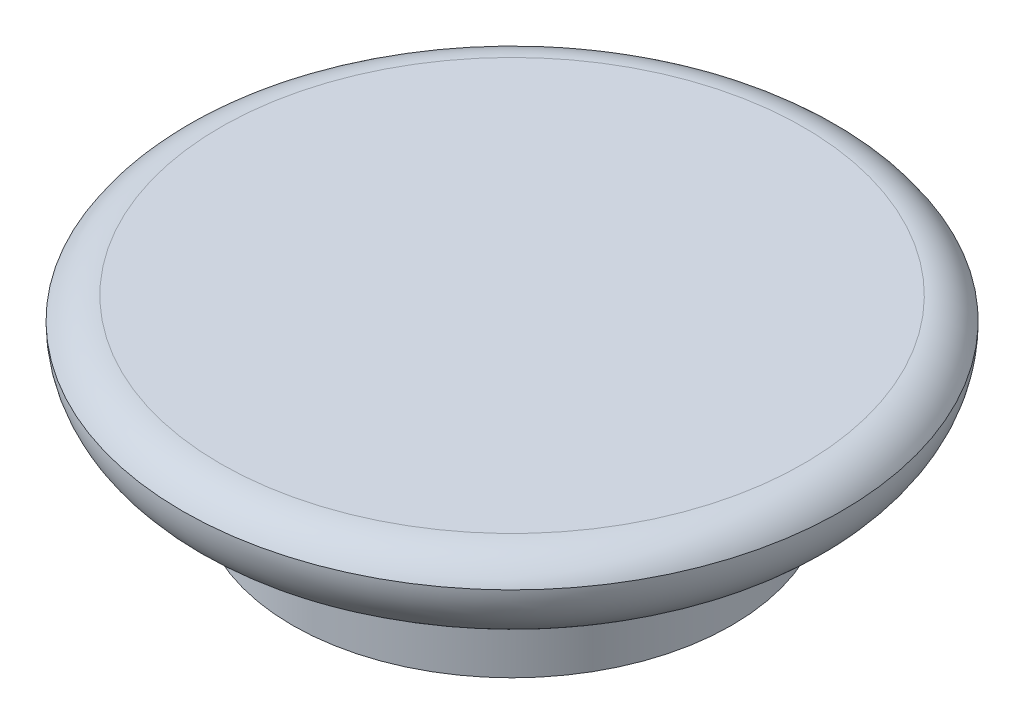
ISO-10303-21;
HEADER;
FILE_DESCRIPTION(('STEP AP214'),'2;1');
FILE_NAME('part.step','',(''),(''),'','','');
FILE_SCHEMA(('AUTOMOTIVE_DESIGN { 1 0 10303 214 1 1 1 1 }'));
ENDSEC;
DATA;
#1=APPLICATION_CONTEXT('core data for automotive mechanical design processes');
#2=APPLICATION_PROTOCOL_DEFINITION('international standard','automotive_design',2000,#1);
#3=PRODUCT_CONTEXT('',#1,'mechanical');
#4=PRODUCT('Part','Part','',(#3));
#5=PRODUCT_RELATED_PRODUCT_CATEGORY('part','',(#4));
#6=PRODUCT_DEFINITION_FORMATION('','',#4);
#7=PRODUCT_DEFINITION_CONTEXT('part definition',#1,'design');
#8=PRODUCT_DEFINITION('design','',#6,#7);
#9=PRODUCT_DEFINITION_SHAPE('','',#8);
#10=(LENGTH_UNIT() NAMED_UNIT(*) SI_UNIT(.MILLI.,.METRE.));
#11=(NAMED_UNIT(*) PLANE_ANGLE_UNIT() SI_UNIT($,.RADIAN.));
#12=(NAMED_UNIT(*) SI_UNIT($,.STERADIAN.) SOLID_ANGLE_UNIT());
#13=UNCERTAINTY_MEASURE_WITH_UNIT(LENGTH_MEASURE(1.E-05),#10,'distance_accuracy_value','');
#14=(GEOMETRIC_REPRESENTATION_CONTEXT(3) GLOBAL_UNCERTAINTY_ASSIGNED_CONTEXT((#13)) GLOBAL_UNIT_ASSIGNED_CONTEXT((#10,
#11,#12)) REPRESENTATION_CONTEXT('',''));
#15=CARTESIAN_POINT('',(0.,0.,0.));
#16=DIRECTION('',(0.,0.,1.));
#17=DIRECTION('',(1.,0.,0.));
#18=AXIS2_PLACEMENT_3D('',#15,#16,#17);
#19=CARTESIAN_POINT('',(0.,20.,0.));
#20=DIRECTION('',(0.,-1.,0.));
#21=DIRECTION('',(0.,0.,-1.));
#22=AXIS2_PLACEMENT_3D('',#19,#20,#21);
#23=CYLINDRICAL_SURFACE('',#22,50.);
#24=CARTESIAN_POINT('',(0.,20.,0.));
#25=DIRECTION('',(0.,1.,0.));
#26=DIRECTION('',(0.,0.,1.));
#27=AXIS2_PLACEMENT_3D('',#24,#25,#26);
#28=CIRCLE('',#27,50.);
#29=CARTESIAN_POINT('',(0.,20.,50.));
#30=VERTEX_POINT('',#29);
#31=EDGE_CURVE('E57',#30,#30,#28,.T.);
#32=ORIENTED_EDGE('',*,*,#31,.F.);
#33=EDGE_LOOP('',(#32));
#34=FACE_BOUND('',#33,.T.);
#35=CARTESIAN_POINT('',(0.,0.,0.));
#36=DIRECTION('',(0.,1.,0.));
#37=DIRECTION('',(0.,0.,1.));
#38=AXIS2_PLACEMENT_3D('',#35,#36,#37);
#39=CIRCLE('',#38,50.);
#40=CARTESIAN_POINT('',(0.,0.,50.));
#41=VERTEX_POINT('',#40);
#42=EDGE_CURVE('E60',#41,#41,#39,.T.);
#43=ORIENTED_EDGE('',*,*,#42,.T.);
#44=EDGE_LOOP('',(#43));
#45=FACE_BOUND('',#44,.T.);
#46=ADVANCED_FACE('F39',(#34,#45),#23,.T.);
#47=CARTESIAN_POINT('',(0.,0.,0.));
#48=DIRECTION('',(0.,1.,0.));
#49=DIRECTION('',(0.,0.,1.));
#50=AXIS2_PLACEMENT_3D('',#47,#48,#49);
#51=PLANE('',#50);
#52=ORIENTED_EDGE('',*,*,#42,.F.);
#53=EDGE_LOOP('',(#52));
#54=FACE_BOUND('',#53,.T.);
#55=ADVANCED_FACE('F72',(#54),#51,.F.);
#56=CARTESIAN_POINT('',(0.,40.,0.));
#57=DIRECTION('',(0.,1.,0.));
#58=DIRECTION('',(0.,0.,1.));
#59=AXIS2_PLACEMENT_3D('',#56,#57,#58);
#60=PLANE('',#59);
#61=CARTESIAN_POINT('',(0.,40.,0.));
#62=DIRECTION('',(0.,1.,0.));
#63=DIRECTION('',(0.,0.,1.));
#64=AXIS2_PLACEMENT_3D('',#61,#62,#63);
#65=CIRCLE('',#64,66.3397459621556);
#66=CARTESIAN_POINT('',(0.,40.,66.3397459621556));
#67=VERTEX_POINT('',#66);
#68=EDGE_CURVE('E10',#67,#67,#65,.T.);
#69=ORIENTED_EDGE('',*,*,#68,.T.);
#70=EDGE_LOOP('',(#69));
#71=FACE_BOUND('',#70,.T.);
#72=ADVANCED_FACE('F77',(#71),#60,.T.);
#73=CARTESIAN_POINT('',(0.,20.,0.));
#74=DIRECTION('',(0.,1.,0.));
#75=DIRECTION('',(0.,0.,1.));
#76=AXIS2_PLACEMENT_3D('',#73,#74,#75);
#77=PLANE('',#76);
#78=CARTESIAN_POINT('',(0.,20.,0.));
#79=DIRECTION('',(0.,1.,0.));
#80=DIRECTION('',(0.,0.,1.));
#81=AXIS2_PLACEMENT_3D('',#78,#79,#80);
#82=CIRCLE('',#81,60.);
#83=CARTESIAN_POINT('',(0.,20.,60.));
#84=VERTEX_POINT('',#83);
#85=EDGE_CURVE('E47',#84,#84,#82,.F.);
#86=ORIENTED_EDGE('',*,*,#85,.T.);
#87=EDGE_LOOP('',(#86));
#88=FACE_BOUND('',#87,.T.);
#89=ORIENTED_EDGE('',*,*,#31,.T.);
#90=EDGE_LOOP('',(#89));
#91=FACE_BOUND('',#90,.T.);
#92=ADVANCED_FACE('F68',(#88,#91),#77,.F.);
#93=CARTESIAN_POINT('',(0.,35.,0.));
#94=DIRECTION('',(0.,1.,0.));
#95=DIRECTION('',(0.,0.,1.));
#96=AXIS2_PLACEMENT_3D('',#93,#94,#95);
#97=TOROIDAL_SURFACE('',#96,60.,15.);
#98=ORIENTED_EDGE('',*,*,#85,.F.);
#99=EDGE_LOOP('',(#98));
#100=FACE_BOUND('',#99,.T.);
#101=CARTESIAN_POINT('',(0.,35.,0.));
#102=DIRECTION('',(0.,1.,0.));
#103=DIRECTION('',(0.,0.,1.));
#104=AXIS2_PLACEMENT_3D('',#101,#102,#103);
#105=CIRCLE('',#104,75.);
#106=CARTESIAN_POINT('',(0.,35.,75.));
#107=VERTEX_POINT('',#106);
#108=EDGE_CURVE('E52',#107,#107,#105,.T.);
#109=ORIENTED_EDGE('',*,*,#108,.F.);
#110=EDGE_LOOP('',(#109));
#111=FACE_BOUND('',#110,.T.);
#112=ADVANCED_FACE('F84',(#100,#111),#97,.T.);
#113=CARTESIAN_POINT('',(0.,30.,0.));
#114=DIRECTION('',(0.,-1.,0.));
#115=DIRECTION('',(0.,0.,-1.));
#116=AXIS2_PLACEMENT_3D('',#113,#114,#115);
#117=TOROIDAL_SURFACE('',#116,66.3397459621556,10.);
#118=ORIENTED_EDGE('',*,*,#108,.T.);
#119=EDGE_LOOP('',(#118));
#120=FACE_BOUND('',#119,.T.);
#121=ORIENTED_EDGE('',*,*,#68,.F.);
#122=EDGE_LOOP('',(#121));
#123=FACE_BOUND('',#122,.T.);
#124=ADVANCED_FACE('F41',(#120,#123),#117,.T.);
#125=CLOSED_SHELL('',(#46,#55,#72,#92,#112,#124));
#126=MANIFOLD_SOLID_BREP('B2',#125);
#127=ADVANCED_BREP_SHAPE_REPRESENTATION('',(#18,#126),#14);
#128=SHAPE_DEFINITION_REPRESENTATION(#9,#127);
ENDSEC;
END-ISO-10303-21;
